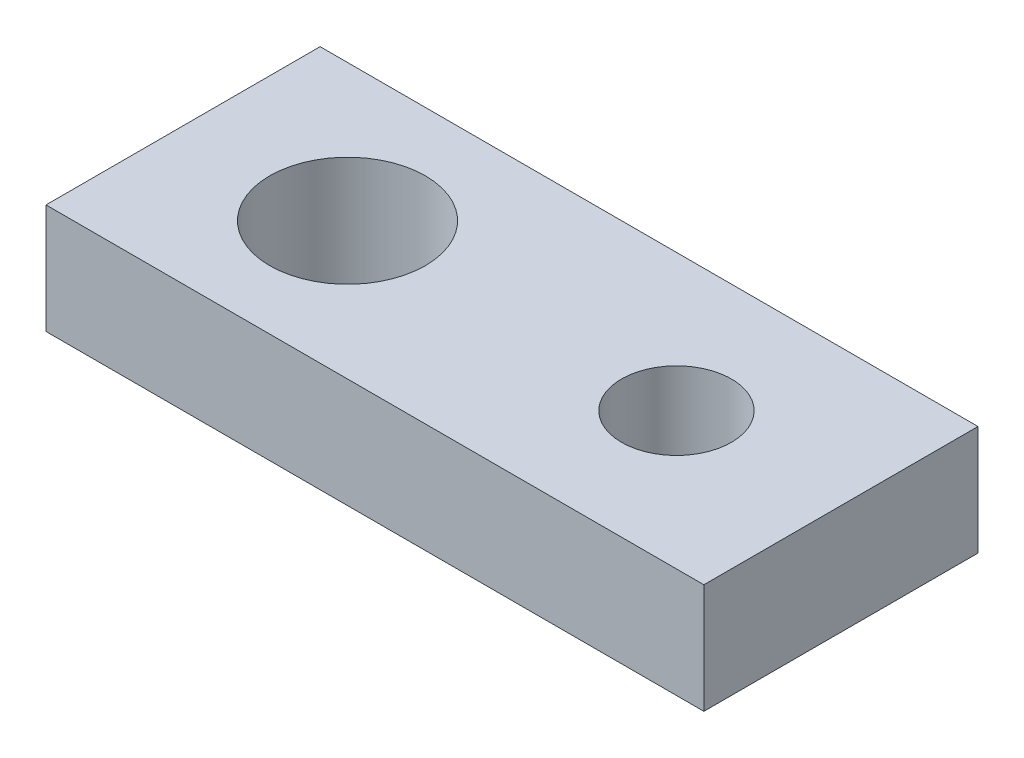
ISO-10303-21;
HEADER;
FILE_DESCRIPTION(('STEP AP214'),'2;1');
FILE_NAME('part.step','',(''),(''),'','','');
FILE_SCHEMA(('AUTOMOTIVE_DESIGN { 1 0 10303 214 1 1 1 1 }'));
ENDSEC;
DATA;
#1=APPLICATION_CONTEXT('core data for automotive mechanical design processes');
#2=APPLICATION_PROTOCOL_DEFINITION('international standard','automotive_design',2000,#1);
#3=PRODUCT_CONTEXT('',#1,'mechanical');
#4=PRODUCT('Part','Part','',(#3));
#5=PRODUCT_RELATED_PRODUCT_CATEGORY('part','',(#4));
#6=PRODUCT_DEFINITION_FORMATION('','',#4);
#7=PRODUCT_DEFINITION_CONTEXT('part definition',#1,'design');
#8=PRODUCT_DEFINITION('design','',#6,#7);
#9=PRODUCT_DEFINITION_SHAPE('','',#8);
#10=(LENGTH_UNIT() NAMED_UNIT(*) SI_UNIT(.MILLI.,.METRE.));
#11=(NAMED_UNIT(*) PLANE_ANGLE_UNIT() SI_UNIT($,.RADIAN.));
#12=(NAMED_UNIT(*) SI_UNIT($,.STERADIAN.) SOLID_ANGLE_UNIT());
#13=UNCERTAINTY_MEASURE_WITH_UNIT(LENGTH_MEASURE(1.E-05),#10,'distance_accuracy_value','');
#14=(GEOMETRIC_REPRESENTATION_CONTEXT(3) GLOBAL_UNCERTAINTY_ASSIGNED_CONTEXT((#13)) GLOBAL_UNIT_ASSIGNED_CONTEXT((#10,
#11,#12)) REPRESENTATION_CONTEXT('',''));
#15=CARTESIAN_POINT('',(0.,0.,0.));
#16=DIRECTION('',(0.,0.,1.));
#17=DIRECTION('',(1.,0.,0.));
#18=AXIS2_PLACEMENT_3D('',#15,#16,#17);
#19=CARTESIAN_POINT('',(38.1,12.7,15.875));
#20=DIRECTION('',(-1.,0.,0.));
#21=DIRECTION('',(0.,0.,1.));
#22=AXIS2_PLACEMENT_3D('',#19,#20,#21);
#23=PLANE('',#22);
#24=DIRECTION('',(0.,0.,-1.));
#25=VECTOR('',#24,1.);
#26=CARTESIAN_POINT('',(38.1,0.,15.875));
#27=LINE('',#26,#25);
#28=CARTESIAN_POINT('',(38.1,0.,15.875));
#29=VERTEX_POINT('',#28);
#30=CARTESIAN_POINT('',(38.1,0.,-15.875));
#31=VERTEX_POINT('',#30);
#32=EDGE_CURVE('E100',#29,#31,#27,.T.);
#33=ORIENTED_EDGE('',*,*,#32,.T.);
#34=DIRECTION('',(0.,-1.,0.));
#35=VECTOR('',#34,1.);
#36=CARTESIAN_POINT('',(38.1,12.7,-15.875));
#37=LINE('',#36,#35);
#38=CARTESIAN_POINT('',(38.1,12.7,-15.875));
#39=VERTEX_POINT('',#38);
#40=EDGE_CURVE('E11',#39,#31,#37,.T.);
#41=ORIENTED_EDGE('',*,*,#40,.F.);
#42=DIRECTION('',(0.,0.,-1.));
#43=VECTOR('',#42,1.);
#44=CARTESIAN_POINT('',(38.1,12.7,15.875));
#45=LINE('',#44,#43);
#46=CARTESIAN_POINT('',(38.1,12.7,15.875));
#47=VERTEX_POINT('',#46);
#48=EDGE_CURVE('E88',#47,#39,#45,.T.);
#49=ORIENTED_EDGE('',*,*,#48,.F.);
#50=DIRECTION('',(0.,-1.,0.));
#51=VECTOR('',#50,1.);
#52=CARTESIAN_POINT('',(38.1,12.7,15.875));
#53=LINE('',#52,#51);
#54=EDGE_CURVE('E96',#47,#29,#53,.T.);
#55=ORIENTED_EDGE('',*,*,#54,.T.);
#56=EDGE_LOOP('',(#33,#41,#49,#55));
#57=FACE_BOUND('',#56,.T.);
#58=ADVANCED_FACE('F37',(#57),#23,.F.);
#59=CARTESIAN_POINT('',(-38.1,12.7,-15.875));
#60=DIRECTION('',(0.,0.,1.));
#61=DIRECTION('',(1.,0.,0.));
#62=AXIS2_PLACEMENT_3D('',#59,#60,#61);
#63=PLANE('',#62);
#64=DIRECTION('',(-1.,0.,0.));
#65=VECTOR('',#64,1.);
#66=CARTESIAN_POINT('',(-38.1,0.,-15.875));
#67=LINE('',#66,#65);
#68=CARTESIAN_POINT('',(-38.1,0.,-15.875));
#69=VERTEX_POINT('',#68);
#70=EDGE_CURVE('E92',#31,#69,#67,.T.);
#71=ORIENTED_EDGE('',*,*,#70,.T.);
#72=DIRECTION('',(0.,-1.,0.));
#73=VECTOR('',#72,1.);
#74=CARTESIAN_POINT('',(-38.1,12.7,-15.875));
#75=LINE('',#74,#73);
#76=CARTESIAN_POINT('',(-38.1,12.7,-15.875));
#77=VERTEX_POINT('',#76);
#78=EDGE_CURVE('E45',#77,#69,#75,.T.);
#79=ORIENTED_EDGE('',*,*,#78,.F.);
#80=DIRECTION('',(-1.,0.,0.));
#81=VECTOR('',#80,1.);
#82=CARTESIAN_POINT('',(-38.1,12.7,-15.875));
#83=LINE('',#82,#81);
#84=EDGE_CURVE('E83',#39,#77,#83,.T.);
#85=ORIENTED_EDGE('',*,*,#84,.F.);
#86=ORIENTED_EDGE('',*,*,#40,.T.);
#87=EDGE_LOOP('',(#71,#79,#85,#86));
#88=FACE_BOUND('',#87,.T.);
#89=ADVANCED_FACE('F91',(#88),#63,.F.);
#90=CARTESIAN_POINT('',(-38.1,12.7,15.875));
#91=DIRECTION('',(1.,0.,0.));
#92=DIRECTION('',(0.,0.,-1.));
#93=AXIS2_PLACEMENT_3D('',#90,#91,#92);
#94=PLANE('',#93);
#95=DIRECTION('',(0.,0.,1.));
#96=VECTOR('',#95,1.);
#97=CARTESIAN_POINT('',(-38.1,0.,15.875));
#98=LINE('',#97,#96);
#99=CARTESIAN_POINT('',(-38.1,0.,15.875));
#100=VERTEX_POINT('',#99);
#101=EDGE_CURVE('E70',#69,#100,#98,.T.);
#102=ORIENTED_EDGE('',*,*,#101,.T.);
#103=DIRECTION('',(0.,-1.,0.));
#104=VECTOR('',#103,1.);
#105=CARTESIAN_POINT('',(-38.1,12.7,15.875));
#106=LINE('',#105,#104);
#107=CARTESIAN_POINT('',(-38.1,12.7,15.875));
#108=VERTEX_POINT('',#107);
#109=EDGE_CURVE('E93',#108,#100,#106,.T.);
#110=ORIENTED_EDGE('',*,*,#109,.F.);
#111=DIRECTION('',(0.,0.,1.));
#112=VECTOR('',#111,1.);
#113=CARTESIAN_POINT('',(-38.1,12.7,15.875));
#114=LINE('',#113,#112);
#115=EDGE_CURVE('E86',#77,#108,#114,.T.);
#116=ORIENTED_EDGE('',*,*,#115,.F.);
#117=ORIENTED_EDGE('',*,*,#78,.T.);
#118=EDGE_LOOP('',(#102,#110,#116,#117));
#119=FACE_BOUND('',#118,.T.);
#120=ADVANCED_FACE('F94',(#119),#94,.F.);
#121=CARTESIAN_POINT('',(-38.1,12.7,15.875));
#122=DIRECTION('',(0.,0.,-1.));
#123=DIRECTION('',(-1.,0.,0.));
#124=AXIS2_PLACEMENT_3D('',#121,#122,#123);
#125=PLANE('',#124);
#126=DIRECTION('',(1.,0.,0.));
#127=VECTOR('',#126,1.);
#128=CARTESIAN_POINT('',(-38.1,0.,15.875));
#129=LINE('',#128,#127);
#130=EDGE_CURVE('E76',#100,#29,#129,.T.);
#131=ORIENTED_EDGE('',*,*,#130,.T.);
#132=ORIENTED_EDGE('',*,*,#54,.F.);
#133=DIRECTION('',(1.,0.,0.));
#134=VECTOR('',#133,1.);
#135=CARTESIAN_POINT('',(-38.1,12.7,15.875));
#136=LINE('',#135,#134);
#137=EDGE_CURVE('E53',#108,#47,#136,.T.);
#138=ORIENTED_EDGE('',*,*,#137,.F.);
#139=ORIENTED_EDGE('',*,*,#109,.T.);
#140=EDGE_LOOP('',(#131,#132,#138,#139));
#141=FACE_BOUND('',#140,.T.);
#142=ADVANCED_FACE('F108',(#141),#125,.F.);
#143=CARTESIAN_POINT('',(0.,12.7,0.));
#144=DIRECTION('',(0.,-1.,0.));
#145=DIRECTION('',(0.,0.,-1.));
#146=AXIS2_PLACEMENT_3D('',#143,#144,#145);
#147=PLANE('',#146);
#148=CARTESIAN_POINT('',(-19.05,12.7,0.));
#149=DIRECTION('',(0.,1.,0.));
#150=DIRECTION('',(0.,0.,1.));
#151=AXIS2_PLACEMENT_3D('',#148,#149,#150);
#152=CIRCLE('',#151,9.017);
#153=CARTESIAN_POINT('',(-19.05,12.7,9.017));
#154=VERTEX_POINT('',#153);
#155=EDGE_CURVE('E120',#154,#154,#152,.T.);
#156=ORIENTED_EDGE('',*,*,#155,.F.);
#157=EDGE_LOOP('',(#156));
#158=FACE_BOUND('',#157,.T.);
#159=CARTESIAN_POINT('',(19.05,12.7,0.));
#160=DIRECTION('',(0.,1.,0.));
#161=DIRECTION('',(0.,0.,1.));
#162=AXIS2_PLACEMENT_3D('',#159,#160,#161);
#163=CIRCLE('',#162,6.3627);
#164=CARTESIAN_POINT('',(19.05,12.7,6.3627));
#165=VERTEX_POINT('',#164);
#166=EDGE_CURVE('E117',#165,#165,#163,.T.);
#167=ORIENTED_EDGE('',*,*,#166,.F.);
#168=EDGE_LOOP('',(#167));
#169=FACE_BOUND('',#168,.T.);
#170=ORIENTED_EDGE('',*,*,#48,.T.);
#171=ORIENTED_EDGE('',*,*,#84,.T.);
#172=ORIENTED_EDGE('',*,*,#115,.T.);
#173=ORIENTED_EDGE('',*,*,#137,.T.);
#174=EDGE_LOOP('',(#170,#171,#172,#173));
#175=FACE_BOUND('',#174,.T.);
#176=ADVANCED_FACE('F84',(#158,#169,#175),#147,.F.);
#177=CARTESIAN_POINT('',(0.,0.,0.));
#178=DIRECTION('',(0.,-1.,0.));
#179=DIRECTION('',(0.,0.,-1.));
#180=AXIS2_PLACEMENT_3D('',#177,#178,#179);
#181=PLANE('',#180);
#182=CARTESIAN_POINT('',(-19.05,0.,0.));
#183=DIRECTION('',(0.,1.,0.));
#184=DIRECTION('',(0.,0.,1.));
#185=AXIS2_PLACEMENT_3D('',#182,#183,#184);
#186=CIRCLE('',#185,9.017);
#187=CARTESIAN_POINT('',(-19.05,0.,9.017));
#188=VERTEX_POINT('',#187);
#189=EDGE_CURVE('E103',#188,#188,#186,.T.);
#190=ORIENTED_EDGE('',*,*,#189,.T.);
#191=EDGE_LOOP('',(#190));
#192=FACE_BOUND('',#191,.T.);
#193=CARTESIAN_POINT('',(19.05,0.,0.));
#194=DIRECTION('',(0.,1.,0.));
#195=DIRECTION('',(0.,0.,1.));
#196=AXIS2_PLACEMENT_3D('',#193,#194,#195);
#197=CIRCLE('',#196,6.3627);
#198=CARTESIAN_POINT('',(19.05,0.,6.3627));
#199=VERTEX_POINT('',#198);
#200=EDGE_CURVE('E114',#199,#199,#197,.T.);
#201=ORIENTED_EDGE('',*,*,#200,.T.);
#202=EDGE_LOOP('',(#201));
#203=FACE_BOUND('',#202,.T.);
#204=ORIENTED_EDGE('',*,*,#32,.F.);
#205=ORIENTED_EDGE('',*,*,#130,.F.);
#206=ORIENTED_EDGE('',*,*,#101,.F.);
#207=ORIENTED_EDGE('',*,*,#70,.F.);
#208=EDGE_LOOP('',(#204,#205,#206,#207));
#209=FACE_BOUND('',#208,.T.);
#210=ADVANCED_FACE('F111',(#192,#203,#209),#181,.T.);
#211=CARTESIAN_POINT('',(19.05,0.,0.));
#212=DIRECTION('',(0.,1.,0.));
#213=DIRECTION('',(0.,0.,1.));
#214=AXIS2_PLACEMENT_3D('',#211,#212,#213);
#215=CYLINDRICAL_SURFACE('',#214,6.3627);
#216=ORIENTED_EDGE('',*,*,#200,.F.);
#217=EDGE_LOOP('',(#216));
#218=FACE_BOUND('',#217,.T.);
#219=ORIENTED_EDGE('',*,*,#166,.T.);
#220=EDGE_LOOP('',(#219));
#221=FACE_BOUND('',#220,.T.);
#222=ADVANCED_FACE('F131',(#218,#221),#215,.F.);
#223=CARTESIAN_POINT('',(-19.05,0.,0.));
#224=DIRECTION('',(0.,1.,0.));
#225=DIRECTION('',(0.,0.,1.));
#226=AXIS2_PLACEMENT_3D('',#223,#224,#225);
#227=CYLINDRICAL_SURFACE('',#226,9.017);
#228=ORIENTED_EDGE('',*,*,#189,.F.);
#229=EDGE_LOOP('',(#228));
#230=FACE_BOUND('',#229,.T.);
#231=ORIENTED_EDGE('',*,*,#155,.T.);
#232=EDGE_LOOP('',(#231));
#233=FACE_BOUND('',#232,.T.);
#234=ADVANCED_FACE('F128',(#230,#233),#227,.F.);
#235=CLOSED_SHELL('',(#58,#89,#120,#142,#176,#210,#222,#234));
#236=MANIFOLD_SOLID_BREP('B2',#235);
#237=ADVANCED_BREP_SHAPE_REPRESENTATION('',(#18,#236),#14);
#238=SHAPE_DEFINITION_REPRESENTATION(#9,#237);
ENDSEC;
END-ISO-10303-21;
